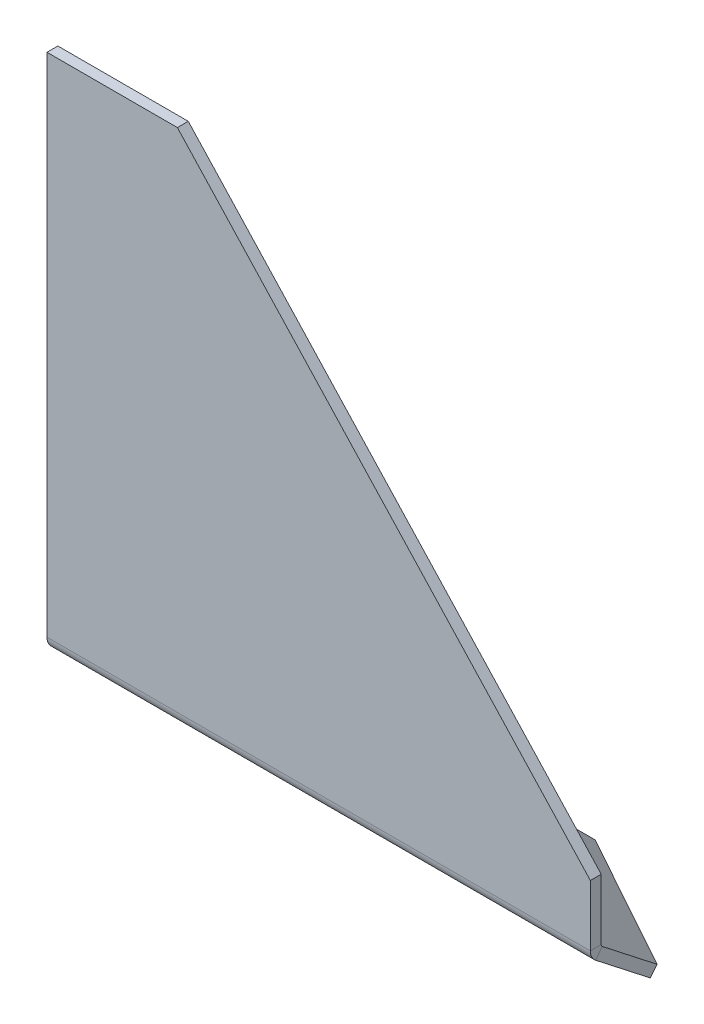
ISO-10303-21;
HEADER;
FILE_DESCRIPTION(('STEP AP214'),'2;1');
FILE_NAME('part.step','',(''),(''),'','','');
FILE_SCHEMA(('AUTOMOTIVE_DESIGN { 1 0 10303 214 1 1 1 1 }'));
ENDSEC;
DATA;
#1=APPLICATION_CONTEXT('core data for automotive mechanical design processes');
#2=APPLICATION_PROTOCOL_DEFINITION('international standard','automotive_design',2000,#1);
#3=PRODUCT_CONTEXT('',#1,'mechanical');
#4=PRODUCT('Part','Part','',(#3));
#5=PRODUCT_RELATED_PRODUCT_CATEGORY('part','',(#4));
#6=PRODUCT_DEFINITION_FORMATION('','',#4);
#7=PRODUCT_DEFINITION_CONTEXT('part definition',#1,'design');
#8=PRODUCT_DEFINITION('design','',#6,#7);
#9=PRODUCT_DEFINITION_SHAPE('','',#8);
#10=(LENGTH_UNIT() NAMED_UNIT(*) SI_UNIT(.MILLI.,.METRE.));
#11=(NAMED_UNIT(*) PLANE_ANGLE_UNIT() SI_UNIT($,.RADIAN.));
#12=(NAMED_UNIT(*) SI_UNIT($,.STERADIAN.) SOLID_ANGLE_UNIT());
#13=UNCERTAINTY_MEASURE_WITH_UNIT(LENGTH_MEASURE(1.E-05),#10,'distance_accuracy_value','');
#14=(GEOMETRIC_REPRESENTATION_CONTEXT(3) GLOBAL_UNCERTAINTY_ASSIGNED_CONTEXT((#13)) GLOBAL_UNIT_ASSIGNED_CONTEXT((#10,
#11,#12)) REPRESENTATION_CONTEXT('',''));
#15=CARTESIAN_POINT('',(0.,0.,0.));
#16=DIRECTION('',(0.,0.,1.));
#17=DIRECTION('',(1.,0.,0.));
#18=AXIS2_PLACEMENT_3D('',#15,#16,#17);
#19=CARTESIAN_POINT('',(177.443609022556,-110.528271250003,-3.84338524674338));
#20=DIRECTION('',(-1.,0.,0.));
#21=DIRECTION('',(0.,-1.,0.));
#22=AXIS2_PLACEMENT_3D('',#19,#20,#21);
#23=PLANE('',#22);
#24=DIRECTION('',(0.,-0.788010753606719,0.615661475325662));
#25=VECTOR('',#24,1.);
#26=CARTESIAN_POINT('',(177.443609022556,-150.621792872391,-55.1607527524704));
#27=LINE('',#26,#25);
#28=CARTESIAN_POINT('',(177.443609022556,-150.621792872391,-55.1607527524704));
#29=VERTEX_POINT('',#28);
#30=CARTESIAN_POINT('',(177.443609022556,-142.741685336324,-61.3173675057271));
#31=VERTEX_POINT('',#30);
#32=EDGE_CURVE('E140',#29,#31,#27,.F.);
#33=ORIENTED_EDGE('',*,*,#32,.T.);
#34=DIRECTION('',(0.,-0.615661475325662,-0.788010753606719));
#35=VECTOR('',#34,1.);
#36=CARTESIAN_POINT('',(177.443609022556,-102.648163713936,-9.99999999999999));
#37=LINE('',#36,#35);
#38=CARTESIAN_POINT('',(177.443609022556,-103.398859126538,-10.9608463116858));
#39=VERTEX_POINT('',#38);
#40=EDGE_CURVE('E150',#31,#39,#37,.F.);
#41=ORIENTED_EDGE('',*,*,#40,.T.);
#42=DIRECTION('',(0.,0.788010753606719,-0.615661475325662));
#43=VECTOR('',#42,1.);
#44=CARTESIAN_POINT('',(177.443609022556,-111.278966662605,-4.80423155842922));
#45=LINE('',#44,#43);
#46=CARTESIAN_POINT('',(177.443609022556,-111.278966662605,-4.8042315584292));
#47=VERTEX_POINT('',#46);
#48=EDGE_CURVE('E153',#39,#47,#45,.F.);
#49=ORIENTED_EDGE('',*,*,#48,.T.);
#50=DIRECTION('',(0.,0.615661475325662,0.788010753606719));
#51=VECTOR('',#50,1.);
#52=CARTESIAN_POINT('',(177.443609022556,-61.9590553197461,58.322376265367));
#53=LINE('',#52,#51);
#54=EDGE_CURVE('E152',#29,#47,#53,.T.);
#55=ORIENTED_EDGE('',*,*,#54,.F.);
#56=EDGE_LOOP('',(#33,#41,#49,#55));
#57=FACE_BOUND('',#56,.T.);
#58=ADVANCED_FACE('F60',(#57),#23,.F.);
#59=CARTESIAN_POINT('',(0.,-61.9590553197461,58.322376265367));
#60=DIRECTION('',(0.,0.788010753606719,-0.615661475325662));
#61=DIRECTION('',(0.,0.615661475325662,0.788010753606719));
#62=AXIS2_PLACEMENT_3D('',#59,#60,#61);
#63=PLANE('',#62);
#64=DIRECTION('',(-0.679764665159936,-0.451544778465565,-0.577950960757471));
#65=VECTOR('',#64,1.);
#66=CARTESIAN_POINT('',(-202.556390977444,-403.042997755912,-378.245161731225));
#67=LINE('',#66,#65);
#68=CARTESIAN_POINT('',(-202.556390977444,-403.042997755912,-378.245161731225));
#69=VERTEX_POINT('',#68);
#70=EDGE_CURVE('E77',#29,#69,#67,.T.);
#71=ORIENTED_EDGE('',*,*,#70,.F.);
#72=ORIENTED_EDGE('',*,*,#54,.T.);
#73=DIRECTION('',(-1.,0.,0.));
#74=VECTOR('',#73,1.);
#75=CARTESIAN_POINT('',(177.443609022556,-111.278966662605,-4.80423155842921));
#76=LINE('',#75,#74);
#77=CARTESIAN_POINT('',(-322.556390977444,-111.278966662605,-4.80423155842918));
#78=VERTEX_POINT('',#77);
#79=EDGE_CURVE('E169',#78,#47,#76,.F.);
#80=ORIENTED_EDGE('',*,*,#79,.F.);
#81=DIRECTION('',(0.,-0.615661475325662,-0.788010753606719));
#82=VECTOR('',#81,1.);
#83=CARTESIAN_POINT('',(-322.556390977444,-61.9590553197462,58.322376265367));
#84=LINE('',#83,#82);
#85=CARTESIAN_POINT('',(-322.556390977444,-403.042997755912,-378.245161731225));
#86=VERTEX_POINT('',#85);
#87=EDGE_CURVE('E159',#78,#86,#84,.T.);
#88=ORIENTED_EDGE('',*,*,#87,.T.);
#89=DIRECTION('',(1.,0.,0.));
#90=VECTOR('',#89,1.);
#91=CARTESIAN_POINT('',(0.,-403.042997755912,-378.245161731225));
#92=LINE('',#91,#90);
#93=EDGE_CURVE('E162',#86,#69,#92,.T.);
#94=ORIENTED_EDGE('',*,*,#93,.T.);
#95=EDGE_LOOP('',(#71,#72,#80,#88,#94));
#96=FACE_BOUND('',#95,.T.);
#97=ADVANCED_FACE('F248',(#96),#63,.F.);
#98=CARTESIAN_POINT('',(0.,-54.078947783679,52.1657615121104));
#99=DIRECTION('',(0.,0.788010753606719,-0.615661475325662));
#100=DIRECTION('',(0.,0.615661475325662,0.788010753606719));
#101=AXIS2_PLACEMENT_3D('',#98,#99,#100);
#102=PLANE('',#101);
#103=ORIENTED_EDGE('',*,*,#40,.F.);
#104=DIRECTION('',(-0.679764665159936,-0.451544778465565,-0.577950960757471));
#105=VECTOR('',#104,1.);
#106=CARTESIAN_POINT('',(-202.556390977444,-395.162890219845,-384.401776484482));
#107=LINE('',#106,#105);
#108=CARTESIAN_POINT('',(-202.556390977444,-395.162890219845,-384.401776484482));
#109=VERTEX_POINT('',#108);
#110=EDGE_CURVE('E137',#31,#109,#107,.T.);
#111=ORIENTED_EDGE('',*,*,#110,.T.);
#112=DIRECTION('',(-1.,0.,0.));
#113=VECTOR('',#112,1.);
#114=CARTESIAN_POINT('',(177.443609022556,-395.162890219845,-384.401776484482));
#115=LINE('',#114,#113);
#116=CARTESIAN_POINT('',(-322.556390977444,-395.162890219845,-384.401776484482));
#117=VERTEX_POINT('',#116);
#118=EDGE_CURVE('E160',#117,#109,#115,.F.);
#119=ORIENTED_EDGE('',*,*,#118,.F.);
#120=DIRECTION('',(0.,0.615661475325662,0.788010753606719));
#121=VECTOR('',#120,1.);
#122=CARTESIAN_POINT('',(-322.556390977444,-395.162890219845,-384.401776484482));
#123=LINE('',#122,#121);
#124=CARTESIAN_POINT('',(-322.556390977444,-103.398859126538,-10.9608463116858));
#125=VERTEX_POINT('',#124);
#126=EDGE_CURVE('E164',#125,#117,#123,.F.);
#127=ORIENTED_EDGE('',*,*,#126,.F.);
#128=DIRECTION('',(-1.,0.,0.));
#129=VECTOR('',#128,1.);
#130=CARTESIAN_POINT('',(177.443609022556,-103.398859126538,-10.9608463116858));
#131=LINE('',#130,#129);
#132=EDGE_CURVE('E158',#39,#125,#131,.T.);
#133=ORIENTED_EDGE('',*,*,#132,.F.);
#134=EDGE_LOOP('',(#103,#111,#119,#127,#133));
#135=FACE_BOUND('',#134,.T.);
#136=ADVANCED_FACE('F156',(#135),#102,.T.);
#137=CARTESIAN_POINT('',(177.443609022556,-403.042997755912,-378.245161731225));
#138=DIRECTION('',(0.,0.615661475325662,0.788010753606719));
#139=DIRECTION('',(0.,-0.788010753606719,0.615661475325662));
#140=AXIS2_PLACEMENT_3D('',#137,#138,#139);
#141=PLANE('',#140);
#142=DIRECTION('',(0.,-0.788010753606719,0.615661475325662));
#143=VECTOR('',#142,1.);
#144=CARTESIAN_POINT('',(-202.556390977444,-403.042997755912,-378.245161731225));
#145=LINE('',#144,#143);
#146=EDGE_CURVE('E141',#69,#109,#145,.F.);
#147=ORIENTED_EDGE('',*,*,#146,.F.);
#148=ORIENTED_EDGE('',*,*,#93,.F.);
#149=DIRECTION('',(0.,0.788010753606719,-0.615661475325662));
#150=VECTOR('',#149,1.);
#151=CARTESIAN_POINT('',(-322.556390977444,-403.042997755912,-378.245161731225));
#152=LINE('',#151,#150);
#153=EDGE_CURVE('E195',#86,#117,#152,.T.);
#154=ORIENTED_EDGE('',*,*,#153,.T.);
#155=ORIENTED_EDGE('',*,*,#118,.T.);
#156=EDGE_LOOP('',(#147,#148,#154,#155));
#157=FACE_BOUND('',#156,.T.);
#158=ADVANCED_FACE('F258',(#157),#141,.F.);
#159=CARTESIAN_POINT('',(-322.556390977444,-115.338345864662,-10.));
#160=DIRECTION('',(-1.,0.,0.));
#161=DIRECTION('',(0.,0.,1.));
#162=AXIS2_PLACEMENT_3D('',#159,#160,#161);
#163=PLANE('',#162);
#164=DIRECTION('',(0.,-1.,0.));
#165=VECTOR('',#164,1.);
#166=CARTESIAN_POINT('',(-322.556390977444,-115.338345864662,-10.));
#167=LINE('',#166,#165);
#168=CARTESIAN_POINT('',(-322.556390977444,364.661654135338,-10.));
#169=VERTEX_POINT('',#168);
#170=CARTESIAN_POINT('',(-322.556390977444,-101.428832242521,-10.));
#171=VERTEX_POINT('',#170);
#172=EDGE_CURVE('E199',#169,#171,#167,.T.);
#173=ORIENTED_EDGE('',*,*,#172,.T.);
#174=DIRECTION('',(0.,0.,1.));
#175=VECTOR('',#174,1.);
#176=CARTESIAN_POINT('',(-322.556390977444,-101.428832242521,-9.99999999999998));
#177=LINE('',#176,#175);
#178=CARTESIAN_POINT('',(-322.556390977444,-101.428832242521,0.));
#179=VERTEX_POINT('',#178);
#180=EDGE_CURVE('E183',#171,#179,#177,.T.);
#181=ORIENTED_EDGE('',*,*,#180,.T.);
#182=DIRECTION('',(0.,-1.,0.));
#183=VECTOR('',#182,1.);
#184=CARTESIAN_POINT('',(-322.556390977444,-115.338345864662,0.));
#185=LINE('',#184,#183);
#186=CARTESIAN_POINT('',(-322.556390977444,364.661654135338,0.));
#187=VERTEX_POINT('',#186);
#188=EDGE_CURVE('E197',#187,#179,#185,.T.);
#189=ORIENTED_EDGE('',*,*,#188,.F.);
#190=DIRECTION('',(0.,0.,1.));
#191=VECTOR('',#190,1.);
#192=CARTESIAN_POINT('',(-322.556390977444,364.661654135338,-10.));
#193=LINE('',#192,#191);
#194=EDGE_CURVE('E13',#169,#187,#193,.T.);
#195=ORIENTED_EDGE('',*,*,#194,.F.);
#196=EDGE_LOOP('',(#173,#181,#189,#195));
#197=FACE_BOUND('',#196,.T.);
#198=ADVANCED_FACE('F62',(#197),#163,.T.);
#199=CARTESIAN_POINT('',(0.,0.,-10.));
#200=DIRECTION('',(0.,0.,-1.));
#201=DIRECTION('',(-1.,0.,0.));
#202=AXIS2_PLACEMENT_3D('',#199,#200,#201);
#203=PLANE('',#202);
#204=DIRECTION('',(0.,1.,0.));
#205=VECTOR('',#204,1.);
#206=CARTESIAN_POINT('',(177.443609022556,-45.3383458646616,-10.));
#207=LINE('',#206,#205);
#208=CARTESIAN_POINT('',(177.443609022556,-101.428832242521,-10.));
#209=VERTEX_POINT('',#208);
#210=CARTESIAN_POINT('',(177.443609022556,-45.3383458646616,-10.));
#211=VERTEX_POINT('',#210);
#212=EDGE_CURVE('E202',#209,#211,#207,.T.);
#213=ORIENTED_EDGE('',*,*,#212,.F.);
#214=DIRECTION('',(-1.,0.,0.));
#215=VECTOR('',#214,1.);
#216=CARTESIAN_POINT('',(-322.556390977444,-101.428832242521,-9.99999999999998));
#217=LINE('',#216,#215);
#218=EDGE_CURVE('E189',#171,#209,#217,.F.);
#219=ORIENTED_EDGE('',*,*,#218,.F.);
#220=ORIENTED_EDGE('',*,*,#172,.F.);
#221=DIRECTION('',(-1.,0.,0.));
#222=VECTOR('',#221,1.);
#223=CARTESIAN_POINT('',(-322.556390977444,364.661654135338,-10.));
#224=LINE('',#223,#222);
#225=CARTESIAN_POINT('',(-202.556390977444,364.661654135338,-10.));
#226=VERTEX_POINT('',#225);
#227=EDGE_CURVE('E208',#226,#169,#224,.T.);
#228=ORIENTED_EDGE('',*,*,#227,.F.);
#229=DIRECTION('',(-0.679764665159936,0.733430296619931,0.));
#230=VECTOR('',#229,1.);
#231=CARTESIAN_POINT('',(-202.556390977444,364.661654135338,-10.));
#232=LINE('',#231,#230);
#233=EDGE_CURVE('E205',#211,#226,#232,.T.);
#234=ORIENTED_EDGE('',*,*,#233,.F.);
#235=EDGE_LOOP('',(#213,#219,#220,#228,#234));
#236=FACE_BOUND('',#235,.T.);
#237=ADVANCED_FACE('F265',(#236),#203,.T.);
#238=CARTESIAN_POINT('',(0.,0.,0.));
#239=DIRECTION('',(0.,0.,-1.));
#240=DIRECTION('',(-1.,0.,0.));
#241=AXIS2_PLACEMENT_3D('',#238,#239,#240);
#242=PLANE('',#241);
#243=DIRECTION('',(-1.,0.,0.));
#244=VECTOR('',#243,1.);
#245=CARTESIAN_POINT('',(-322.556390977444,-101.428832242521,0.));
#246=LINE('',#245,#244);
#247=CARTESIAN_POINT('',(177.443609022556,-101.428832242521,0.));
#248=VERTEX_POINT('',#247);
#249=EDGE_CURVE('E177',#179,#248,#246,.F.);
#250=ORIENTED_EDGE('',*,*,#249,.T.);
#251=DIRECTION('',(0.,1.,0.));
#252=VECTOR('',#251,1.);
#253=CARTESIAN_POINT('',(177.443609022556,-45.3383458646616,0.));
#254=LINE('',#253,#252);
#255=CARTESIAN_POINT('',(177.443609022556,-45.3383458646616,0.));
#256=VERTEX_POINT('',#255);
#257=EDGE_CURVE('E213',#248,#256,#254,.T.);
#258=ORIENTED_EDGE('',*,*,#257,.T.);
#259=DIRECTION('',(-0.679764665159936,0.733430296619931,0.));
#260=VECTOR('',#259,1.);
#261=CARTESIAN_POINT('',(-202.556390977444,364.661654135338,0.));
#262=LINE('',#261,#260);
#263=CARTESIAN_POINT('',(-202.556390977444,364.661654135338,0.));
#264=VERTEX_POINT('',#263);
#265=EDGE_CURVE('E215',#256,#264,#262,.T.);
#266=ORIENTED_EDGE('',*,*,#265,.T.);
#267=DIRECTION('',(-1.,0.,0.));
#268=VECTOR('',#267,1.);
#269=CARTESIAN_POINT('',(-322.556390977444,364.661654135338,0.));
#270=LINE('',#269,#268);
#271=EDGE_CURVE('E203',#264,#187,#270,.T.);
#272=ORIENTED_EDGE('',*,*,#271,.T.);
#273=ORIENTED_EDGE('',*,*,#188,.T.);
#274=EDGE_LOOP('',(#250,#258,#266,#272,#273));
#275=FACE_BOUND('',#274,.T.);
#276=ADVANCED_FACE('F228',(#275),#242,.F.);
#277=CARTESIAN_POINT('',(-322.556390977444,364.661654135338,-10.));
#278=DIRECTION('',(0.,1.,0.));
#279=DIRECTION('',(0.,0.,1.));
#280=AXIS2_PLACEMENT_3D('',#277,#278,#279);
#281=PLANE('',#280);
#282=ORIENTED_EDGE('',*,*,#271,.F.);
#283=DIRECTION('',(0.,0.,1.));
#284=VECTOR('',#283,1.);
#285=CARTESIAN_POINT('',(-202.556390977444,364.661654135338,-10.));
#286=LINE('',#285,#284);
#287=EDGE_CURVE('E69',#226,#264,#286,.T.);
#288=ORIENTED_EDGE('',*,*,#287,.F.);
#289=ORIENTED_EDGE('',*,*,#227,.T.);
#290=ORIENTED_EDGE('',*,*,#194,.T.);
#291=EDGE_LOOP('',(#282,#288,#289,#290));
#292=FACE_BOUND('',#291,.T.);
#293=ADVANCED_FACE('F230',(#292),#281,.T.);
#294=CARTESIAN_POINT('',(-202.556390977444,364.661654135338,-10.));
#295=DIRECTION('',(0.733430296619931,0.679764665159936,0.));
#296=DIRECTION('',(-0.679764665159936,0.733430296619931,0.));
#297=AXIS2_PLACEMENT_3D('',#294,#295,#296);
#298=PLANE('',#297);
#299=ORIENTED_EDGE('',*,*,#265,.F.);
#300=DIRECTION('',(0.,0.,1.));
#301=VECTOR('',#300,1.);
#302=CARTESIAN_POINT('',(177.443609022556,-45.3383458646616,-10.));
#303=LINE('',#302,#301);
#304=EDGE_CURVE('E64',#211,#256,#303,.T.);
#305=ORIENTED_EDGE('',*,*,#304,.F.);
#306=ORIENTED_EDGE('',*,*,#233,.T.);
#307=ORIENTED_EDGE('',*,*,#287,.T.);
#308=EDGE_LOOP('',(#299,#305,#306,#307));
#309=FACE_BOUND('',#308,.T.);
#310=ADVANCED_FACE('F225',(#309),#298,.T.);
#311=CARTESIAN_POINT('',(177.443609022556,-45.3383458646616,-10.));
#312=DIRECTION('',(1.,0.,0.));
#313=DIRECTION('',(0.,1.,0.));
#314=AXIS2_PLACEMENT_3D('',#311,#312,#313);
#315=PLANE('',#314);
#316=DIRECTION('',(0.,0.,1.));
#317=VECTOR('',#316,1.);
#318=CARTESIAN_POINT('',(177.443609022556,-101.428832242521,-9.99999999999998));
#319=LINE('',#318,#317);
#320=EDGE_CURVE('E85',#209,#248,#319,.T.);
#321=ORIENTED_EDGE('',*,*,#320,.F.);
#322=ORIENTED_EDGE('',*,*,#212,.T.);
#323=ORIENTED_EDGE('',*,*,#304,.T.);
#324=ORIENTED_EDGE('',*,*,#257,.F.);
#325=EDGE_LOOP('',(#321,#322,#323,#324));
#326=FACE_BOUND('',#325,.T.);
#327=ADVANCED_FACE('F223',(#326),#315,.T.);
#328=CARTESIAN_POINT('',(177.443609022556,-101.428832242521,-12.5));
#329=DIRECTION('',(1.,0.,0.));
#330=DIRECTION('',(0.,0.,-1.));
#331=AXIS2_PLACEMENT_3D('',#328,#329,#330);
#332=PLANE('',#331);
#333=ORIENTED_EDGE('',*,*,#48,.F.);
#334=CARTESIAN_POINT('',(177.443609022556,-101.428832242521,-12.5));
#335=DIRECTION('',(-1.,0.,0.));
#336=DIRECTION('',(0.,0.,1.));
#337=AXIS2_PLACEMENT_3D('',#334,#335,#336);
#338=CIRCLE('',#337,2.49999999999999);
#339=EDGE_CURVE('E186',#209,#39,#338,.F.);
#340=ORIENTED_EDGE('',*,*,#339,.F.);
#341=ORIENTED_EDGE('',*,*,#320,.T.);
#342=CARTESIAN_POINT('',(177.443609022556,-101.428832242521,-12.5));
#343=DIRECTION('',(-1.,0.,0.));
#344=DIRECTION('',(0.,0.,1.));
#345=AXIS2_PLACEMENT_3D('',#342,#343,#344);
#346=CIRCLE('',#345,12.5);
#347=EDGE_CURVE('E179',#248,#47,#346,.F.);
#348=ORIENTED_EDGE('',*,*,#347,.T.);
#349=EDGE_LOOP('',(#333,#340,#341,#348));
#350=FACE_BOUND('',#349,.T.);
#351=ADVANCED_FACE('F288',(#350),#332,.T.);
#352=CARTESIAN_POINT('',(-322.556390977444,-101.428832242521,-12.5));
#353=DIRECTION('',(1.,0.,0.));
#354=DIRECTION('',(0.,0.,-1.));
#355=AXIS2_PLACEMENT_3D('',#352,#353,#354);
#356=PLANE('',#355);
#357=CARTESIAN_POINT('',(-322.556390977444,-101.428832242521,-12.5));
#358=DIRECTION('',(-1.,0.,0.));
#359=DIRECTION('',(0.,0.,1.));
#360=AXIS2_PLACEMENT_3D('',#357,#358,#359);
#361=CIRCLE('',#360,2.49999999999999);
#362=EDGE_CURVE('E192',#125,#171,#361,.T.);
#363=ORIENTED_EDGE('',*,*,#362,.F.);
#364=DIRECTION('',(0.,0.788010753606719,-0.615661475325662));
#365=VECTOR('',#364,1.);
#366=CARTESIAN_POINT('',(-322.556390977444,-103.398859126538,-10.9608463116858));
#367=LINE('',#366,#365);
#368=EDGE_CURVE('E172',#125,#78,#367,.F.);
#369=ORIENTED_EDGE('',*,*,#368,.T.);
#370=CARTESIAN_POINT('',(-322.556390977444,-101.428832242521,-12.5));
#371=DIRECTION('',(-1.,0.,0.));
#372=DIRECTION('',(0.,0.,1.));
#373=AXIS2_PLACEMENT_3D('',#370,#371,#372);
#374=CIRCLE('',#373,12.5);
#375=EDGE_CURVE('E180',#78,#179,#374,.T.);
#376=ORIENTED_EDGE('',*,*,#375,.T.);
#377=ORIENTED_EDGE('',*,*,#180,.F.);
#378=EDGE_LOOP('',(#363,#369,#376,#377));
#379=FACE_BOUND('',#378,.T.);
#380=ADVANCED_FACE('F242',(#379),#356,.F.);
#381=CARTESIAN_POINT('',(-322.556390977444,-101.428832242521,-12.5));
#382=DIRECTION('',(-1.,0.,0.));
#383=DIRECTION('',(0.,-0.788010753606719,0.615661475325662));
#384=AXIS2_PLACEMENT_3D('',#381,#382,#383);
#385=CYLINDRICAL_SURFACE('',#384,12.5);
#386=ORIENTED_EDGE('',*,*,#249,.F.);
#387=ORIENTED_EDGE('',*,*,#375,.F.);
#388=ORIENTED_EDGE('',*,*,#79,.T.);
#389=ORIENTED_EDGE('',*,*,#347,.F.);
#390=EDGE_LOOP('',(#386,#387,#388,#389));
#391=FACE_BOUND('',#390,.T.);
#392=ADVANCED_FACE('F239',(#391),#385,.T.);
#393=CARTESIAN_POINT('',(-322.556390977444,-101.428832242521,-12.5));
#394=DIRECTION('',(-1.,0.,0.));
#395=DIRECTION('',(0.,-0.788010753606719,0.615661475325662));
#396=AXIS2_PLACEMENT_3D('',#393,#394,#395);
#397=CYLINDRICAL_SURFACE('',#396,2.49999999999999);
#398=ORIENTED_EDGE('',*,*,#218,.T.);
#399=ORIENTED_EDGE('',*,*,#339,.T.);
#400=ORIENTED_EDGE('',*,*,#132,.T.);
#401=ORIENTED_EDGE('',*,*,#362,.T.);
#402=EDGE_LOOP('',(#398,#399,#400,#401));
#403=FACE_BOUND('',#402,.T.);
#404=ADVANCED_FACE('F279',(#403),#397,.F.);
#405=CARTESIAN_POINT('',(-322.556390977444,-403.042997755912,-378.245161731225));
#406=DIRECTION('',(1.,0.,0.));
#407=DIRECTION('',(0.,1.,0.));
#408=AXIS2_PLACEMENT_3D('',#405,#406,#407);
#409=PLANE('',#408);
#410=ORIENTED_EDGE('',*,*,#368,.F.);
#411=ORIENTED_EDGE('',*,*,#126,.T.);
#412=ORIENTED_EDGE('',*,*,#153,.F.);
#413=ORIENTED_EDGE('',*,*,#87,.F.);
#414=EDGE_LOOP('',(#410,#411,#412,#413));
#415=FACE_BOUND('',#414,.T.);
#416=ADVANCED_FACE('F252',(#415),#409,.F.);
#417=CARTESIAN_POINT('',(-202.556390977444,-403.042997755912,-378.245161731225));
#418=DIRECTION('',(0.733430296619931,-0.418504916626621,-0.5356618660679));
#419=DIRECTION('',(-0.679764665159936,-0.451544778465565,-0.577950960757471));
#420=AXIS2_PLACEMENT_3D('',#417,#418,#419);
#421=PLANE('',#420);
#422=ORIENTED_EDGE('',*,*,#32,.F.);
#423=ORIENTED_EDGE('',*,*,#70,.T.);
#424=ORIENTED_EDGE('',*,*,#146,.T.);
#425=ORIENTED_EDGE('',*,*,#110,.F.);
#426=EDGE_LOOP('',(#422,#423,#424,#425));
#427=FACE_BOUND('',#426,.T.);
#428=ADVANCED_FACE('F139',(#427),#421,.T.);
#429=CLOSED_SHELL('',(#58,#97,#136,#158,#198,#237,#276,#293,#310,#327,#351,#380,#392,#404,#416,#428));
#430=MANIFOLD_SOLID_BREP('B2',#429);
#431=ADVANCED_BREP_SHAPE_REPRESENTATION('',(#18,#430),#14);
#432=SHAPE_DEFINITION_REPRESENTATION(#9,#431);
ENDSEC;
END-ISO-10303-21;
